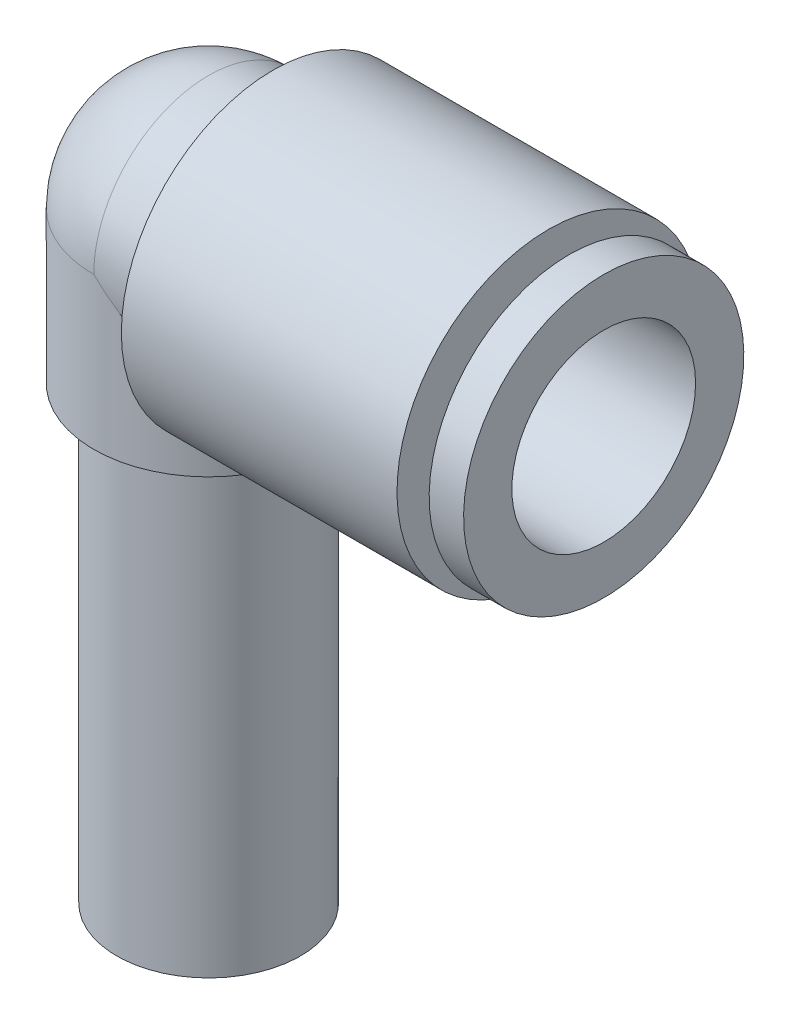
ISO-10303-21;
HEADER;
FILE_DESCRIPTION(('STEP AP214'),'2;1');
FILE_NAME('part.step','',(''),(''),'','','');
FILE_SCHEMA(('AUTOMOTIVE_DESIGN { 1 0 10303 214 1 1 1 1 }'));
ENDSEC;
DATA;
#1=APPLICATION_CONTEXT('core data for automotive mechanical design processes');
#2=APPLICATION_PROTOCOL_DEFINITION('international standard','automotive_design',2000,#1);
#3=PRODUCT_CONTEXT('',#1,'mechanical');
#4=PRODUCT('Part','Part','',(#3));
#5=PRODUCT_RELATED_PRODUCT_CATEGORY('part','',(#4));
#6=PRODUCT_DEFINITION_FORMATION('','',#4);
#7=PRODUCT_DEFINITION_CONTEXT('part definition',#1,'design');
#8=PRODUCT_DEFINITION('design','',#6,#7);
#9=PRODUCT_DEFINITION_SHAPE('','',#8);
#10=(LENGTH_UNIT() NAMED_UNIT(*) SI_UNIT(.MILLI.,.METRE.));
#11=(NAMED_UNIT(*) PLANE_ANGLE_UNIT() SI_UNIT($,.RADIAN.));
#12=(NAMED_UNIT(*) SI_UNIT($,.STERADIAN.) SOLID_ANGLE_UNIT());
#13=UNCERTAINTY_MEASURE_WITH_UNIT(LENGTH_MEASURE(1.E-05),#10,'distance_accuracy_value','');
#14=(GEOMETRIC_REPRESENTATION_CONTEXT(3) GLOBAL_UNCERTAINTY_ASSIGNED_CONTEXT((#13)) GLOBAL_UNIT_ASSIGNED_CONTEXT((#10,
#11,#12)) REPRESENTATION_CONTEXT('',''));
#15=CARTESIAN_POINT('',(0.,0.,0.));
#16=DIRECTION('',(0.,0.,1.));
#17=DIRECTION('',(1.,0.,0.));
#18=AXIS2_PLACEMENT_3D('',#15,#16,#17);
#19=CARTESIAN_POINT('',(3.,0.,0.));
#20=DIRECTION('',(1.,0.,0.));
#21=DIRECTION('',(0.,0.,-1.));
#22=AXIS2_PLACEMENT_3D('',#19,#20,#21);
#23=PLANE('',#22);
#24=CARTESIAN_POINT('',(3.,0.,0.));
#25=DIRECTION('',(1.,0.,0.));
#26=DIRECTION('',(0.,0.,-1.));
#27=AXIS2_PLACEMENT_3D('',#24,#25,#26);
#28=CIRCLE('',#27,4.);
#29=CARTESIAN_POINT('',(3.,0.,-4.));
#30=VERTEX_POINT('',#29);
#31=EDGE_CURVE('E19',#30,#30,#28,.T.);
#32=ORIENTED_EDGE('',*,*,#31,.T.);
#33=EDGE_LOOP('',(#32));
#34=FACE_BOUND('',#33,.T.);
#35=ADVANCED_FACE('F16',(#34),#23,.T.);
#36=CARTESIAN_POINT('',(17.2,0.,0.));
#37=DIRECTION('',(1.,0.,0.));
#38=DIRECTION('',(0.,0.,-1.));
#39=AXIS2_PLACEMENT_3D('',#36,#37,#38);
#40=CYLINDRICAL_SURFACE('',#39,4.);
#41=CARTESIAN_POINT('',(17.2,0.,0.));
#42=DIRECTION('',(1.,0.,0.));
#43=DIRECTION('',(0.,0.,-1.));
#44=AXIS2_PLACEMENT_3D('',#41,#42,#43);
#45=CIRCLE('',#44,4.);
#46=CARTESIAN_POINT('',(17.2,0.,-4.));
#47=VERTEX_POINT('',#46);
#48=EDGE_CURVE('E178',#47,#47,#45,.T.);
#49=ORIENTED_EDGE('',*,*,#48,.T.);
#50=EDGE_LOOP('',(#49));
#51=FACE_BOUND('',#50,.T.);
#52=ORIENTED_EDGE('',*,*,#31,.F.);
#53=EDGE_LOOP('',(#52));
#54=FACE_BOUND('',#53,.T.);
#55=ADVANCED_FACE('F167',(#51,#54),#40,.F.);
#56=CARTESIAN_POINT('',(17.2,6.10000000000002,0.));
#57=DIRECTION('',(-1.,0.,0.));
#58=DIRECTION('',(0.,-1.,0.));
#59=AXIS2_PLACEMENT_3D('',#56,#57,#58);
#60=PLANE('',#59);
#61=ORIENTED_EDGE('',*,*,#48,.F.);
#62=EDGE_LOOP('',(#61));
#63=FACE_BOUND('',#62,.T.);
#64=CARTESIAN_POINT('',(17.2,0.,0.));
#65=DIRECTION('',(1.,0.,0.));
#66=DIRECTION('',(0.,1.,0.));
#67=AXIS2_PLACEMENT_3D('',#64,#65,#66);
#68=CIRCLE('',#67,6.09999999999997);
#69=CARTESIAN_POINT('',(17.2,6.10000000000003,0.));
#70=VERTEX_POINT('',#69);
#71=EDGE_CURVE('E181',#70,#70,#68,.F.);
#72=ORIENTED_EDGE('',*,*,#71,.F.);
#73=EDGE_LOOP('',(#72));
#74=FACE_BOUND('',#73,.T.);
#75=ADVANCED_FACE('F164',(#63,#74),#60,.F.);
#76=CARTESIAN_POINT('',(17.2,0.,0.));
#77=DIRECTION('',(1.,0.,0.));
#78=DIRECTION('',(0.,1.,0.));
#79=AXIS2_PLACEMENT_3D('',#76,#77,#78);
#80=CYLINDRICAL_SURFACE('',#79,6.09999999999997);
#81=CARTESIAN_POINT('',(15.7,0.,0.));
#82=DIRECTION('',(1.,0.,0.));
#83=DIRECTION('',(0.,1.,0.));
#84=AXIS2_PLACEMENT_3D('',#81,#82,#83);
#85=CIRCLE('',#84,6.09999999999997);
#86=CARTESIAN_POINT('',(15.7,6.10000000000002,0.));
#87=VERTEX_POINT('',#86);
#88=EDGE_CURVE('E183',#87,#87,#85,.T.);
#89=ORIENTED_EDGE('',*,*,#88,.T.);
#90=EDGE_LOOP('',(#89));
#91=FACE_BOUND('',#90,.T.);
#92=ORIENTED_EDGE('',*,*,#71,.T.);
#93=EDGE_LOOP('',(#92));
#94=FACE_BOUND('',#93,.T.);
#95=ADVANCED_FACE('F160',(#91,#94),#80,.T.);
#96=CARTESIAN_POINT('',(15.7000000000001,4.475,0.));
#97=DIRECTION('',(1.,0.,0.));
#98=DIRECTION('',(0.,1.,0.));
#99=AXIS2_PLACEMENT_3D('',#96,#97,#98);
#100=PLANE('',#99);
#101=CARTESIAN_POINT('',(15.7000000000002,0.,0.));
#102=DIRECTION('',(1.,0.,0.));
#103=DIRECTION('',(0.,1.,0.));
#104=AXIS2_PLACEMENT_3D('',#101,#102,#103);
#105=CIRCLE('',#104,4.47499999999995);
#106=CARTESIAN_POINT('',(15.7000000000002,4.475,0.));
#107=VERTEX_POINT('',#106);
#108=EDGE_CURVE('E188',#107,#107,#105,.F.);
#109=ORIENTED_EDGE('',*,*,#108,.F.);
#110=EDGE_LOOP('',(#109));
#111=FACE_BOUND('',#110,.T.);
#112=ORIENTED_EDGE('',*,*,#88,.F.);
#113=EDGE_LOOP('',(#112));
#114=FACE_BOUND('',#113,.T.);
#115=ADVANCED_FACE('F156',(#111,#114),#100,.F.);
#116=CARTESIAN_POINT('',(17.2,0.,0.));
#117=DIRECTION('',(1.,0.,0.));
#118=DIRECTION('',(0.,1.,0.));
#119=AXIS2_PLACEMENT_3D('',#116,#117,#118);
#120=CYLINDRICAL_SURFACE('',#119,4.47499999999995);
#121=CARTESIAN_POINT('',(14.8,0.,0.));
#122=DIRECTION('',(1.,0.,0.));
#123=DIRECTION('',(0.,1.,0.));
#124=AXIS2_PLACEMENT_3D('',#121,#122,#123);
#125=CIRCLE('',#124,4.47499999999995);
#126=CARTESIAN_POINT('',(14.8,4.475,0.));
#127=VERTEX_POINT('',#126);
#128=EDGE_CURVE('E191',#127,#127,#125,.T.);
#129=ORIENTED_EDGE('',*,*,#128,.T.);
#130=EDGE_LOOP('',(#129));
#131=FACE_BOUND('',#130,.T.);
#132=ORIENTED_EDGE('',*,*,#108,.T.);
#133=EDGE_LOOP('',(#132));
#134=FACE_BOUND('',#133,.T.);
#135=ADVANCED_FACE('F152',(#131,#134),#120,.T.);
#136=CARTESIAN_POINT('',(14.8,6.6,0.));
#137=DIRECTION('',(-1.,0.,0.));
#138=DIRECTION('',(0.,-1.,0.));
#139=AXIS2_PLACEMENT_3D('',#136,#137,#138);
#140=PLANE('',#139);
#141=ORIENTED_EDGE('',*,*,#128,.F.);
#142=EDGE_LOOP('',(#141));
#143=FACE_BOUND('',#142,.T.);
#144=CARTESIAN_POINT('',(14.8,0.,0.));
#145=DIRECTION('',(1.,0.,0.));
#146=DIRECTION('',(0.,1.,0.));
#147=AXIS2_PLACEMENT_3D('',#144,#145,#146);
#148=CIRCLE('',#147,6.59999999999997);
#149=CARTESIAN_POINT('',(14.8,6.60000000000002,0.));
#150=VERTEX_POINT('',#149);
#151=EDGE_CURVE('E144',#150,#150,#148,.F.);
#152=ORIENTED_EDGE('',*,*,#151,.F.);
#153=EDGE_LOOP('',(#152));
#154=FACE_BOUND('',#153,.T.);
#155=ADVANCED_FACE('F149',(#143,#154),#140,.F.);
#156=CARTESIAN_POINT('',(0.,0.,0.));
#157=DIRECTION('',(0.517190674118776,0.582894074551346,0.626696341506392));
#158=DIRECTION('',(-0.0678903564651674,-0.701985222593758,0.708948268041487));
#159=AXIS2_PLACEMENT_3D('',#156,#157,#158);
#160=SPHERICAL_SURFACE('',#159,5.);
#161=CARTESIAN_POINT('',(0.,0.,0.));
#162=DIRECTION('',(1.,0.,0.));
#163=DIRECTION('',(0.,1.,0.));
#164=AXIS2_PLACEMENT_3D('',#161,#162,#163);
#165=CIRCLE('',#164,4.99999999999999);
#166=CARTESIAN_POINT('',(0.,0.,-5.));
#167=VERTEX_POINT('',#166);
#168=CARTESIAN_POINT('',(0.,0.,5.));
#169=VERTEX_POINT('',#168);
#170=EDGE_CURVE('E52',#167,#169,#165,.T.);
#171=ORIENTED_EDGE('',*,*,#170,.F.);
#172=CARTESIAN_POINT('',(0.,0.,0.));
#173=DIRECTION('',(0.,-1.,0.));
#174=DIRECTION('',(0.,0.,-1.));
#175=AXIS2_PLACEMENT_3D('',#172,#173,#174);
#176=CIRCLE('',#175,5.);
#177=EDGE_CURVE('E49',#169,#167,#176,.T.);
#178=ORIENTED_EDGE('',*,*,#177,.F.);
#179=EDGE_LOOP('',(#171,#178));
#180=FACE_BOUND('',#179,.T.);
#181=ADVANCED_FACE('F54',(#180),#160,.T.);
#182=CARTESIAN_POINT('',(17.2,0.,0.));
#183=DIRECTION('',(1.,0.,0.));
#184=DIRECTION('',(0.,1.,0.));
#185=AXIS2_PLACEMENT_3D('',#182,#183,#184);
#186=CYLINDRICAL_SURFACE('',#185,6.59999999999997);
#187=CARTESIAN_POINT('',(2.79999999997928,0.,0.));
#188=DIRECTION('',(1.,0.,0.));
#189=DIRECTION('',(0.,1.,0.));
#190=AXIS2_PLACEMENT_3D('',#187,#188,#189);
#191=CIRCLE('',#190,6.5999999999917);
#192=CARTESIAN_POINT('',(2.79999999998388,-5.13809303145684,4.14246303545247));
#193=VERTEX_POINT('',#192);
#194=CARTESIAN_POINT('',(2.79999999998779,-5.13809303145405,-4.14246303544982));
#195=VERTEX_POINT('',#194);
#196=EDGE_CURVE('E142',#193,#195,#191,.F.);
#197=ORIENTED_EDGE('',*,*,#196,.F.);
#198=CARTESIAN_POINT('',(5.,-6.59999999999994,0.));
#199=CARTESIAN_POINT('',(5.0000271351499,-6.6000288321867,0.122504688268254));
#200=CARTESIAN_POINT('',(4.99549903974391,-6.59659043266096,0.244992056861479));
#201=CARTESIAN_POINT('',(4.97753766866719,-6.58299458451561,0.488860049478457));
#202=CARTESIAN_POINT('',(4.96411012716975,-6.57284146239717,0.610241335164552));
#203=CARTESIAN_POINT('',(4.92868467500972,-6.5461291097179,0.850105020170916));
#204=CARTESIAN_POINT('',(4.90675015947332,-6.5296172714463,0.96860212782482));
#205=CARTESIAN_POINT('',(4.85466183315833,-6.49056568002604,1.20276516267301));
#206=CARTESIAN_POINT('',(4.82450712830986,-6.46802527118421,1.31843078040774));
#207=CARTESIAN_POINT('',(4.75649777273119,-6.417457060169,1.54589203438756));
#208=CARTESIAN_POINT('',(4.71866358014657,-6.38944384483019,1.6576970481014));
#209=CARTESIAN_POINT('',(4.63572298637735,-6.32843915664868,1.87719361174896));
#210=CARTESIAN_POINT('',(4.59061368775097,-6.29544570067237,1.98488350153537));
#211=CARTESIAN_POINT('',(4.44495636574125,-6.18976043069958,2.30136658877083));
#212=CARTESIAN_POINT('',(4.33415207645882,-6.11041900836166,2.50333299935649));
#213=CARTESIAN_POINT('',(4.07772313262611,-5.93115789051157,2.90414582430537));
#214=CARTESIAN_POINT('',(3.92981824735306,-5.83001052363109,3.10095446094772));
#215=CARTESIAN_POINT('',(3.60974985049775,-5.61922906599554,3.46828544430644));
#216=CARTESIAN_POINT('',(3.43760234648801,-5.50960059672696,3.63882498234936));
#217=CARTESIAN_POINT('',(3.18211672843556,-5.35560981677331,3.85787900419389));
#218=CARTESIAN_POINT('',(3.10798357836849,-5.31184558651123,3.91785027730318));
#219=CARTESIAN_POINT('',(2.95645751557303,-5.22463607116637,4.03341090017799));
#220=CARTESIAN_POINT('',(2.87907081315166,-5.18119034912541,4.08900806410798));
#221=CARTESIAN_POINT('',(2.79999999999631,-5.13809303146398,4.14246303544409));
#222=B_SPLINE_CURVE_WITH_KNOTS('',3,(#198,#199,#200,#201,#202,#203,#204,#205,#206,#207,#208,
#209,#210,#211,#212,#213,#214,#215,#216,#217,#218,#219,#220,#221),.UNSPECIFIED.,.F.,.F.,(4,2,2,
2,2,2,2,2,2,2,2,4),(0.,0.367354882107537,0.734473296535869,1.09890689393271,1.46338014481933,
1.82689489084714,2.19055477231053,2.91863742613174,3.7144462710018,4.50973208031084,
4.82437390855453,5.13844023837244),.UNSPECIFIED.);
#223=CARTESIAN_POINT('',(5.,-6.59999999999997,0.));
#224=VERTEX_POINT('',#223);
#225=EDGE_CURVE('E71',#224,#193,#222,.T.);
#226=ORIENTED_EDGE('',*,*,#225,.F.);
#227=CARTESIAN_POINT('',(2.79999999999631,-5.13809303146398,-4.14246303544409));
#228=CARTESIAN_POINT('',(2.92066122626968,-5.2038984485885,-4.06086666178317));
#229=CARTESIAN_POINT('',(3.03748716335086,-5.27050042786802,-3.97425382259231));
#230=CARTESIAN_POINT('',(3.26324617419009,-5.40373211412606,-3.79110254799243));
#231=CARTESIAN_POINT('',(3.37217301094682,-5.4703618021219,-3.69455641180674));
#232=CARTESIAN_POINT('',(3.58267733830717,-5.60257564266625,-3.49084946796501));
#233=CARTESIAN_POINT('',(3.68417876530659,-5.66814472346093,-3.38359990587483));
#234=CARTESIAN_POINT('',(3.87807341663731,-5.79604552581133,-3.1595141780589));
#235=CARTESIAN_POINT('',(3.9704697889475,-5.85837836271349,-3.04268135142883));
#236=CARTESIAN_POINT('',(4.20415380033416,-6.01859996019535,-2.71800275983237));
#237=CARTESIAN_POINT('',(4.33677437936429,-6.11236360712594,-2.50157865067198));
#238=CARTESIAN_POINT('',(4.5111785837869,-6.23771934927604,-2.15998788292295));
#239=CARTESIAN_POINT('',(4.5651236041589,-6.27687927337338,-2.04360282810323));
#240=CARTESIAN_POINT('',(4.66440960331433,-6.34945365572728,-1.80551613605723));
#241=CARTESIAN_POINT('',(4.70975522877908,-6.38287121594722,-1.68381741405927));
#242=CARTESIAN_POINT('',(4.79075406552107,-6.44287152043947,-1.43713197653354));
#243=CARTESIAN_POINT('',(4.82650671676847,-6.4695242186888,-1.31219500091978));
#244=CARTESIAN_POINT('',(4.88837317226124,-6.51580947968787,-1.05869275313488));
#245=CARTESIAN_POINT('',(4.91448859608257,-6.53544322198487,-0.930128094523686));
#246=CARTESIAN_POINT('',(4.95686511352978,-6.56736654261241,-0.668739639423607));
#247=CARTESIAN_POINT('',(4.97299428781786,-6.57955777646882,-0.535882254238302));
#248=CARTESIAN_POINT('',(4.99458609454036,-6.59589890468122,-0.268693120181804));
#249=CARTESIAN_POINT('',(5.00003881691293,-6.60004132796889,-0.134360117788863));
#250=CARTESIAN_POINT('',(5.,-6.59999999999994,0.));
#251=B_SPLINE_CURVE_WITH_KNOTS('',3,(#227,#228,#229,#230,#231,#232,#233,#234,#235,#236,#237,
#238,#239,#240,#241,#242,#243,#244,#245,#246,#247,#248,#249,#250),.UNSPECIFIED.,.F.,.F.,(4,2,2,
2,2,2,2,2,2,2,2,4),(0.,0.479369807334974,0.95911408653472,1.44323248470175,1.92718291230457,
2.73504055798987,3.1370135269386,3.53876866709066,3.93618249954821,4.33352951451895,
4.7360193863829,5.13888267932341),.UNSPECIFIED.);
#252=EDGE_CURVE('E72',#195,#224,#251,.T.);
#253=ORIENTED_EDGE('',*,*,#252,.F.);
#254=EDGE_LOOP('',(#197,#226,#253));
#255=FACE_BOUND('',#254,.T.);
#256=ORIENTED_EDGE('',*,*,#151,.T.);
#257=EDGE_LOOP('',(#256));
#258=FACE_BOUND('',#257,.T.);
#259=ADVANCED_FACE('F95',(#255,#258),#186,.T.);
#260=CARTESIAN_POINT('',(2.79999999997928,0.,0.));
#261=DIRECTION('',(1.,0.,0.));
#262=DIRECTION('',(0.,1.,0.));
#263=AXIS2_PLACEMENT_3D('',#260,#261,#262);
#264=CONICAL_SURFACE('',#263,6.5999999999917,1.04719755119097);
#265=CARTESIAN_POINT('',(2.7999999999911,-5.13809303146885,4.14246303545032));
#266=CARTESIAN_POINT('',(2.75261181135762,-5.00681686955843,4.17449449757904));
#267=CARTESIAN_POINT('',(2.70585495532641,-4.8749204428005,4.20491341351489));
#268=CARTESIAN_POINT('',(2.61391941215577,-4.60990647474738,4.26267187916648));
#269=CARTESIAN_POINT('',(2.56874075087577,-4.47678891348842,4.29001137844089));
#270=CARTESIAN_POINT('',(2.48042019292435,-4.20978422387554,4.34167291817031));
#271=CARTESIAN_POINT('',(2.43727224203535,-4.0759009205182,4.3660043332364));
#272=CARTESIAN_POINT('',(2.35322823648991,-3.80695856975045,4.41187155827132));
#273=CARTESIAN_POINT('',(2.31233221579155,-3.67189950464563,4.4334073260897));
#274=CARTESIAN_POINT('',(2.19353489287037,-3.26467216377085,4.49402955549752));
#275=CARTESIAN_POINT('',(2.11960558859371,-2.99069511155761,4.5290846451498));
#276=CARTESIAN_POINT('',(2.01946413876891,-2.57588243241388,4.5741794295017));
#277=CARTESIAN_POINT('',(1.98783334440458,-2.43674224300319,4.58797926967402));
#278=CARTESIAN_POINT('',(1.92875724076755,-2.15732641002438,4.61312491353323));
#279=CARTESIAN_POINT('',(1.90131284841362,-2.01705052477716,4.62447017983871));
#280=CARTESIAN_POINT('',(1.87623956927492,-1.87623956930376,4.63462243108186));
#281=B_SPLINE_CURVE_WITH_KNOTS('',3,(#265,#266,#267,#268,#269,#270,#271,#272,#273,#274,#275,
#276,#277,#278,#279,#280),.UNSPECIFIED.,.F.,.F.,(4,2,2,2,2,2,2,4),(0.,0.42957422640073,
0.85915548827306,1.28736228667493,1.71557554047311,2.57277769305553,3.00277159096171,
3.43285953265824),.UNSPECIFIED.);
#282=CARTESIAN_POINT('',(1.87623956929449,-1.87623956929703,4.6346224310742));
#283=VERTEX_POINT('',#282);
#284=EDGE_CURVE('E75',#193,#283,#281,.T.);
#285=ORIENTED_EDGE('',*,*,#284,.F.);
#286=ORIENTED_EDGE('',*,*,#196,.T.);
#287=CARTESIAN_POINT('',(1.87623956927864,-1.87623956929957,-4.63462243107018));
#288=CARTESIAN_POINT('',(1.90131284841473,-2.01705052477431,-4.62447017983452));
#289=CARTESIAN_POINT('',(1.92875724076757,-2.15732641002221,-4.6131249135322));
#290=CARTESIAN_POINT('',(1.9878333444038,-2.43674224300175,-4.58797926967537));
#291=CARTESIAN_POINT('',(2.01946413876843,-2.57588243241248,-4.57417942950227));
#292=CARTESIAN_POINT('',(2.11960558859371,-2.9906951115564,-4.52908464514912));
#293=CARTESIAN_POINT('',(2.19353489287017,-3.26467216376996,-4.49402955549749));
#294=CARTESIAN_POINT('',(2.31233221579133,-3.67189950464499,-4.43340732608988));
#295=CARTESIAN_POINT('',(2.35322823648973,-3.80695856974981,-4.41187155827145));
#296=CARTESIAN_POINT('',(2.43727224203514,-4.07590092051759,-4.36600433323649));
#297=CARTESIAN_POINT('',(2.48042019292408,-4.20978422387495,-4.34167291817039));
#298=CARTESIAN_POINT('',(2.56874075087565,-4.47678891348784,-4.29001137844103));
#299=CARTESIAN_POINT('',(2.61391941215584,-4.6099064747468,-4.26267187916668));
#300=CARTESIAN_POINT('',(2.70585495532602,-4.87492044280016,-4.20491341351489));
#301=CARTESIAN_POINT('',(2.75261181135656,-5.00681686955834,-4.17449449757878));
#302=CARTESIAN_POINT('',(2.79999999998839,-5.13809303146928,-4.14246303544945));
#303=B_SPLINE_CURVE_WITH_KNOTS('',3,(#287,#288,#289,#290,#291,#292,#293,#294,#295,#296,#297,
#298,#299,#300,#301,#302),.UNSPECIFIED.,.F.,.F.,(4,2,2,2,2,2,2,4),(0.,0.430087941697174,
0.860081839603829,1.71728399218689,2.14549724598511,2.57370404438699,3.00328530625947,
3.4328595326604),.UNSPECIFIED.);
#304=CARTESIAN_POINT('',(1.87623956928552,-1.87623956929887,-4.63462243107756));
#305=VERTEX_POINT('',#304);
#306=EDGE_CURVE('E66',#305,#195,#303,.T.);
#307=ORIENTED_EDGE('',*,*,#306,.F.);
#308=CARTESIAN_POINT('',(1.87623956929658,0.,0.));
#309=DIRECTION('',(1.,0.,0.));
#310=DIRECTION('',(0.,1.,0.));
#311=AXIS2_PLACEMENT_3D('',#308,#309,#310);
#312=CIRCLE('',#311,4.99999999999999);
#313=EDGE_CURVE('E59',#283,#305,#312,.F.);
#314=ORIENTED_EDGE('',*,*,#313,.F.);
#315=EDGE_LOOP('',(#285,#286,#307,#314));
#316=FACE_BOUND('',#315,.T.);
#317=ADVANCED_FACE('F112',(#316),#264,.T.);
#318=CARTESIAN_POINT('',(17.2,0.,0.));
#319=DIRECTION('',(1.,0.,0.));
#320=DIRECTION('',(0.,1.,0.));
#321=AXIS2_PLACEMENT_3D('',#318,#319,#320);
#322=CYLINDRICAL_SURFACE('',#321,4.99999999999999);
#323=CARTESIAN_POINT('',(0.,0.,0.));
#324=DIRECTION('',(-0.707106781186547,-0.707106781186548,0.));
#325=DIRECTION('',(0.707106781186548,-0.707106781186547,0.));
#326=AXIS2_PLACEMENT_3D('',#323,#324,#325);
#327=ELLIPSE('',#326,7.07106781186546,5.);
#328=EDGE_CURVE('E58',#167,#305,#327,.T.);
#329=ORIENTED_EDGE('',*,*,#328,.F.);
#330=ORIENTED_EDGE('',*,*,#170,.T.);
#331=CARTESIAN_POINT('',(0.,0.,0.));
#332=DIRECTION('',(0.707106781186547,0.707106781186548,0.));
#333=DIRECTION('',(0.707106781186548,-0.707106781186547,0.));
#334=AXIS2_PLACEMENT_3D('',#331,#332,#333);
#335=ELLIPSE('',#334,7.07106781186546,5.);
#336=EDGE_CURVE('E70',#283,#169,#335,.F.);
#337=ORIENTED_EDGE('',*,*,#336,.F.);
#338=ORIENTED_EDGE('',*,*,#313,.T.);
#339=EDGE_LOOP('',(#329,#330,#337,#338));
#340=FACE_BOUND('',#339,.T.);
#341=ADVANCED_FACE('F62',(#340),#322,.T.);
#342=CARTESIAN_POINT('',(0.,-26.2,0.));
#343=DIRECTION('',(0.,-1.,0.));
#344=DIRECTION('',(0.,0.,-1.));
#345=AXIS2_PLACEMENT_3D('',#342,#343,#344);
#346=CYLINDRICAL_SURFACE('',#345,5.);
#347=ORIENTED_EDGE('',*,*,#284,.T.);
#348=ORIENTED_EDGE('',*,*,#336,.T.);
#349=ORIENTED_EDGE('',*,*,#177,.T.);
#350=ORIENTED_EDGE('',*,*,#328,.T.);
#351=ORIENTED_EDGE('',*,*,#306,.T.);
#352=ORIENTED_EDGE('',*,*,#252,.T.);
#353=CARTESIAN_POINT('',(0.,-6.6,0.));
#354=DIRECTION('',(0.,-1.,0.));
#355=DIRECTION('',(0.,0.,-1.));
#356=AXIS2_PLACEMENT_3D('',#353,#354,#355);
#357=CIRCLE('',#356,5.);
#358=EDGE_CURVE('E32',#224,#224,#357,.F.);
#359=ORIENTED_EDGE('',*,*,#358,.T.);
#360=ORIENTED_EDGE('',*,*,#225,.T.);
#361=EDGE_LOOP('',(#347,#348,#349,#350,#351,#352,#359,#360));
#362=FACE_BOUND('',#361,.T.);
#363=ADVANCED_FACE('F69',(#362),#346,.T.);
#364=CARTESIAN_POINT('',(4.,-26.2,0.));
#365=DIRECTION('',(0.,1.,0.));
#366=DIRECTION('',(0.,0.,1.));
#367=AXIS2_PLACEMENT_3D('',#364,#365,#366);
#368=PLANE('',#367);
#369=CARTESIAN_POINT('',(0.,-26.2,0.));
#370=DIRECTION('',(0.,-1.,0.));
#371=DIRECTION('',(0.,0.,-1.));
#372=AXIS2_PLACEMENT_3D('',#369,#370,#371);
#373=CIRCLE('',#372,4.00000000000006);
#374=CARTESIAN_POINT('',(0.,-26.2,-4.00000000000006));
#375=VERTEX_POINT('',#374);
#376=EDGE_CURVE('E25',#375,#375,#373,.F.);
#377=ORIENTED_EDGE('',*,*,#376,.F.);
#378=EDGE_LOOP('',(#377));
#379=FACE_BOUND('',#378,.T.);
#380=ADVANCED_FACE('F102',(#379),#368,.F.);
#381=CARTESIAN_POINT('',(5.,-6.6,0.));
#382=DIRECTION('',(0.,1.,0.));
#383=DIRECTION('',(0.,0.,1.));
#384=AXIS2_PLACEMENT_3D('',#381,#382,#383);
#385=PLANE('',#384);
#386=CARTESIAN_POINT('',(0.,-6.6,0.));
#387=DIRECTION('',(0.,-1.,0.));
#388=DIRECTION('',(0.,0.,-1.));
#389=AXIS2_PLACEMENT_3D('',#386,#387,#388);
#390=CIRCLE('',#389,4.00000000000006);
#391=CARTESIAN_POINT('',(0.,-6.6,-4.00000000000006));
#392=VERTEX_POINT('',#391);
#393=EDGE_CURVE('E11',#392,#392,#390,.T.);
#394=ORIENTED_EDGE('',*,*,#393,.F.);
#395=EDGE_LOOP('',(#394));
#396=FACE_BOUND('',#395,.T.);
#397=ORIENTED_EDGE('',*,*,#358,.F.);
#398=EDGE_LOOP('',(#397));
#399=FACE_BOUND('',#398,.T.);
#400=ADVANCED_FACE('F126',(#396,#399),#385,.F.);
#401=CARTESIAN_POINT('',(0.,-26.2,0.));
#402=DIRECTION('',(0.,-1.,0.));
#403=DIRECTION('',(0.,0.,-1.));
#404=AXIS2_PLACEMENT_3D('',#401,#402,#403);
#405=CYLINDRICAL_SURFACE('',#404,4.00000000000006);
#406=ORIENTED_EDGE('',*,*,#376,.T.);
#407=EDGE_LOOP('',(#406));
#408=FACE_BOUND('',#407,.T.);
#409=ORIENTED_EDGE('',*,*,#393,.T.);
#410=EDGE_LOOP('',(#409));
#411=FACE_BOUND('',#410,.T.);
#412=ADVANCED_FACE('F124',(#408,#411),#405,.T.);
#413=CLOSED_SHELL('',(#35,#55,#75,#95,#115,#135,#155,#181,#259,#317,#341,#363,#380,#400,#412));
#414=MANIFOLD_SOLID_BREP('B1',#413);
#415=ADVANCED_BREP_SHAPE_REPRESENTATION('',(#18,#414),#14);
#416=SHAPE_DEFINITION_REPRESENTATION(#9,#415);
ENDSEC;
END-ISO-10303-21;
